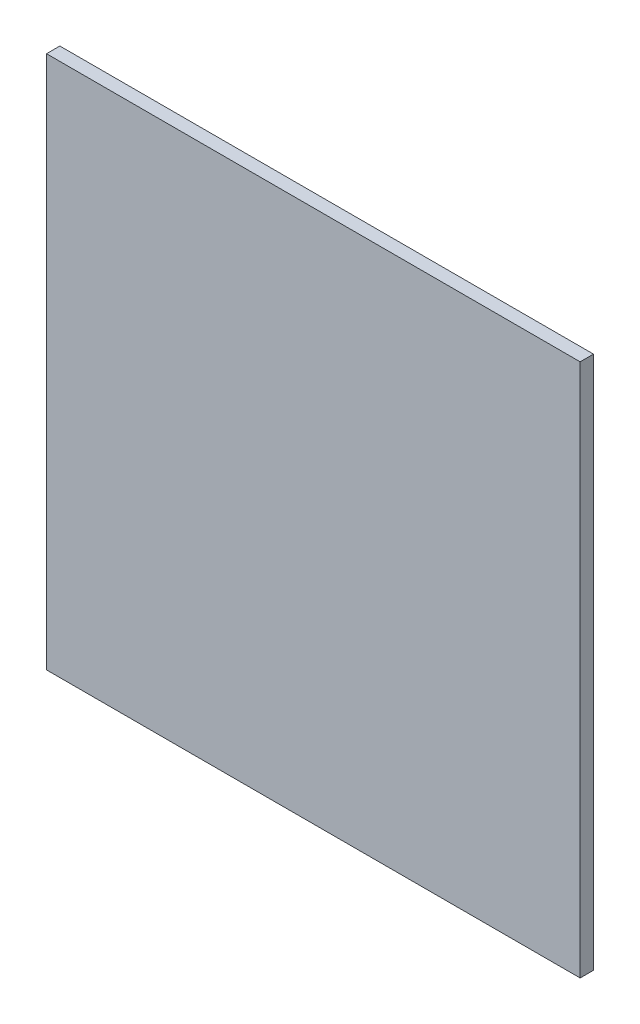
ISO-10303-21;
HEADER;
FILE_DESCRIPTION(('STEP AP214'),'2;1');
FILE_NAME('part.step','',(''),(''),'','','');
FILE_SCHEMA(('AUTOMOTIVE_DESIGN { 1 0 10303 214 1 1 1 1 }'));
ENDSEC;
DATA;
#1=APPLICATION_CONTEXT('core data for automotive mechanical design processes');
#2=APPLICATION_PROTOCOL_DEFINITION('international standard','automotive_design',2000,#1);
#3=PRODUCT_CONTEXT('',#1,'mechanical');
#4=PRODUCT('Part','Part','',(#3));
#5=PRODUCT_RELATED_PRODUCT_CATEGORY('part','',(#4));
#6=PRODUCT_DEFINITION_FORMATION('','',#4);
#7=PRODUCT_DEFINITION_CONTEXT('part definition',#1,'design');
#8=PRODUCT_DEFINITION('design','',#6,#7);
#9=PRODUCT_DEFINITION_SHAPE('','',#8);
#10=(LENGTH_UNIT() NAMED_UNIT(*) SI_UNIT(.MILLI.,.METRE.));
#11=(NAMED_UNIT(*) PLANE_ANGLE_UNIT() SI_UNIT($,.RADIAN.));
#12=(NAMED_UNIT(*) SI_UNIT($,.STERADIAN.) SOLID_ANGLE_UNIT());
#13=UNCERTAINTY_MEASURE_WITH_UNIT(LENGTH_MEASURE(1.E-05),#10,'distance_accuracy_value','');
#14=(GEOMETRIC_REPRESENTATION_CONTEXT(3) GLOBAL_UNCERTAINTY_ASSIGNED_CONTEXT((#13)) GLOBAL_UNIT_ASSIGNED_CONTEXT((#10,
#11,#12)) REPRESENTATION_CONTEXT('',''));
#15=CARTESIAN_POINT('',(0.,0.,0.));
#16=DIRECTION('',(0.,0.,1.));
#17=DIRECTION('',(1.,0.,0.));
#18=AXIS2_PLACEMENT_3D('',#15,#16,#17);
#19=CARTESIAN_POINT('',(0.,0.,-100.));
#20=DIRECTION('',(-1.,0.,0.));
#21=DIRECTION('',(0.,0.,1.));
#22=AXIS2_PLACEMENT_3D('',#19,#20,#21);
#23=PLANE('',#22);
#24=DIRECTION('',(0.,-1.,0.));
#25=VECTOR('',#24,1.);
#26=CARTESIAN_POINT('',(0.,0.,0.));
#27=LINE('',#26,#25);
#28=CARTESIAN_POINT('',(0.,4000.,0.));
#29=VERTEX_POINT('',#28);
#30=CARTESIAN_POINT('',(0.,0.,0.));
#31=VERTEX_POINT('',#30);
#32=EDGE_CURVE('E98',#29,#31,#27,.T.);
#33=ORIENTED_EDGE('',*,*,#32,.F.);
#34=DIRECTION('',(0.,0.,1.));
#35=VECTOR('',#34,1.);
#36=CARTESIAN_POINT('',(0.,4000.,-100.));
#37=LINE('',#36,#35);
#38=CARTESIAN_POINT('',(0.,4000.,-100.));
#39=VERTEX_POINT('',#38);
#40=EDGE_CURVE('E11',#39,#29,#37,.T.);
#41=ORIENTED_EDGE('',*,*,#40,.F.);
#42=DIRECTION('',(0.,-1.,0.));
#43=VECTOR('',#42,1.);
#44=CARTESIAN_POINT('',(0.,0.,-100.));
#45=LINE('',#44,#43);
#46=CARTESIAN_POINT('',(0.,0.,-100.));
#47=VERTEX_POINT('',#46);
#48=EDGE_CURVE('E92',#39,#47,#45,.T.);
#49=ORIENTED_EDGE('',*,*,#48,.T.);
#50=DIRECTION('',(0.,0.,1.));
#51=VECTOR('',#50,1.);
#52=CARTESIAN_POINT('',(0.,0.,-100.));
#53=LINE('',#52,#51);
#54=EDGE_CURVE('E37',#47,#31,#53,.T.);
#55=ORIENTED_EDGE('',*,*,#54,.T.);
#56=EDGE_LOOP('',(#33,#41,#49,#55));
#57=FACE_BOUND('',#56,.T.);
#58=ADVANCED_FACE('F34',(#57),#23,.T.);
#59=CARTESIAN_POINT('',(0.,4000.,-100.));
#60=DIRECTION('',(0.,1.,0.));
#61=DIRECTION('',(0.,0.,1.));
#62=AXIS2_PLACEMENT_3D('',#59,#60,#61);
#63=PLANE('',#62);
#64=DIRECTION('',(-1.,0.,0.));
#65=VECTOR('',#64,1.);
#66=CARTESIAN_POINT('',(0.,4000.,0.));
#67=LINE('',#66,#65);
#68=CARTESIAN_POINT('',(4000.,4000.,0.));
#69=VERTEX_POINT('',#68);
#70=EDGE_CURVE('E94',#69,#29,#67,.T.);
#71=ORIENTED_EDGE('',*,*,#70,.F.);
#72=DIRECTION('',(0.,0.,1.));
#73=VECTOR('',#72,1.);
#74=CARTESIAN_POINT('',(4000.,4000.,-100.));
#75=LINE('',#74,#73);
#76=CARTESIAN_POINT('',(4000.,4000.,-100.));
#77=VERTEX_POINT('',#76);
#78=EDGE_CURVE('E43',#77,#69,#75,.T.);
#79=ORIENTED_EDGE('',*,*,#78,.F.);
#80=DIRECTION('',(-1.,0.,0.));
#81=VECTOR('',#80,1.);
#82=CARTESIAN_POINT('',(0.,4000.,-100.));
#83=LINE('',#82,#81);
#84=EDGE_CURVE('E89',#77,#39,#83,.T.);
#85=ORIENTED_EDGE('',*,*,#84,.T.);
#86=ORIENTED_EDGE('',*,*,#40,.T.);
#87=EDGE_LOOP('',(#71,#79,#85,#86));
#88=FACE_BOUND('',#87,.T.);
#89=ADVANCED_FACE('F108',(#88),#63,.T.);
#90=CARTESIAN_POINT('',(4000.,0.,-100.));
#91=DIRECTION('',(1.,0.,0.));
#92=DIRECTION('',(0.,1.,0.));
#93=AXIS2_PLACEMENT_3D('',#90,#91,#92);
#94=PLANE('',#93);
#95=DIRECTION('',(0.,1.,0.));
#96=VECTOR('',#95,1.);
#97=CARTESIAN_POINT('',(4000.,0.,0.));
#98=LINE('',#97,#96);
#99=CARTESIAN_POINT('',(4000.,0.,0.));
#100=VERTEX_POINT('',#99);
#101=EDGE_CURVE('E84',#100,#69,#98,.T.);
#102=ORIENTED_EDGE('',*,*,#101,.F.);
#103=DIRECTION('',(0.,0.,1.));
#104=VECTOR('',#103,1.);
#105=CARTESIAN_POINT('',(4000.,0.,-100.));
#106=LINE('',#105,#104);
#107=CARTESIAN_POINT('',(4000.,0.,-100.));
#108=VERTEX_POINT('',#107);
#109=EDGE_CURVE('E79',#108,#100,#106,.T.);
#110=ORIENTED_EDGE('',*,*,#109,.F.);
#111=DIRECTION('',(0.,1.,0.));
#112=VECTOR('',#111,1.);
#113=CARTESIAN_POINT('',(4000.,0.,-100.));
#114=LINE('',#113,#112);
#115=EDGE_CURVE('E82',#108,#77,#114,.T.);
#116=ORIENTED_EDGE('',*,*,#115,.T.);
#117=ORIENTED_EDGE('',*,*,#78,.T.);
#118=EDGE_LOOP('',(#102,#110,#116,#117));
#119=FACE_BOUND('',#118,.T.);
#120=ADVANCED_FACE('F81',(#119),#94,.T.);
#121=CARTESIAN_POINT('',(0.,0.,-100.));
#122=DIRECTION('',(0.,-1.,0.));
#123=DIRECTION('',(0.,0.,-1.));
#124=AXIS2_PLACEMENT_3D('',#121,#122,#123);
#125=PLANE('',#124);
#126=DIRECTION('',(1.,0.,0.));
#127=VECTOR('',#126,1.);
#128=CARTESIAN_POINT('',(0.,0.,0.));
#129=LINE('',#128,#127);
#130=EDGE_CURVE('E101',#31,#100,#129,.T.);
#131=ORIENTED_EDGE('',*,*,#130,.F.);
#132=ORIENTED_EDGE('',*,*,#54,.F.);
#133=DIRECTION('',(1.,0.,0.));
#134=VECTOR('',#133,1.);
#135=CARTESIAN_POINT('',(0.,0.,-100.));
#136=LINE('',#135,#134);
#137=EDGE_CURVE('E88',#47,#108,#136,.T.);
#138=ORIENTED_EDGE('',*,*,#137,.T.);
#139=ORIENTED_EDGE('',*,*,#109,.T.);
#140=EDGE_LOOP('',(#131,#132,#138,#139));
#141=FACE_BOUND('',#140,.T.);
#142=ADVANCED_FACE('F91',(#141),#125,.T.);
#143=CARTESIAN_POINT('',(0.,0.,-100.));
#144=DIRECTION('',(0.,0.,-1.));
#145=DIRECTION('',(-1.,0.,0.));
#146=AXIS2_PLACEMENT_3D('',#143,#144,#145);
#147=PLANE('',#146);
#148=ORIENTED_EDGE('',*,*,#48,.F.);
#149=ORIENTED_EDGE('',*,*,#84,.F.);
#150=ORIENTED_EDGE('',*,*,#115,.F.);
#151=ORIENTED_EDGE('',*,*,#137,.F.);
#152=EDGE_LOOP('',(#148,#149,#150,#151));
#153=FACE_BOUND('',#152,.T.);
#154=ADVANCED_FACE('F87',(#153),#147,.T.);
#155=CARTESIAN_POINT('',(0.,0.,0.));
#156=DIRECTION('',(0.,0.,-1.));
#157=DIRECTION('',(-1.,0.,0.));
#158=AXIS2_PLACEMENT_3D('',#155,#156,#157);
#159=PLANE('',#158);
#160=ORIENTED_EDGE('',*,*,#32,.T.);
#161=ORIENTED_EDGE('',*,*,#130,.T.);
#162=ORIENTED_EDGE('',*,*,#101,.T.);
#163=ORIENTED_EDGE('',*,*,#70,.T.);
#164=EDGE_LOOP('',(#160,#161,#162,#163));
#165=FACE_BOUND('',#164,.T.);
#166=ADVANCED_FACE('F107',(#165),#159,.F.);
#167=CLOSED_SHELL('',(#58,#89,#120,#142,#154,#166));
#168=MANIFOLD_SOLID_BREP('B2',#167);
#169=ADVANCED_BREP_SHAPE_REPRESENTATION('',(#18,#168),#14);
#170=SHAPE_DEFINITION_REPRESENTATION(#9,#169);
ENDSEC;
END-ISO-10303-21;
